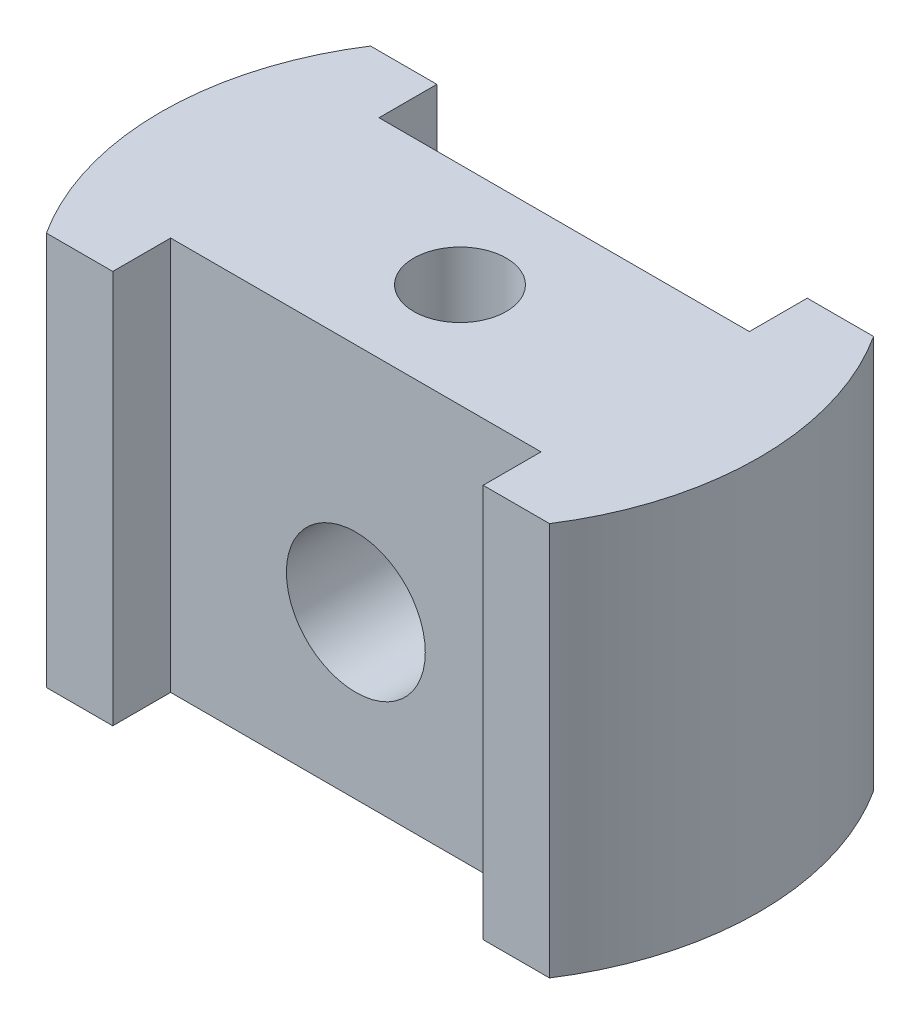
ISO-10303-21;
HEADER;
FILE_DESCRIPTION(('STEP AP214'),'2;1');
FILE_NAME('part.step','',(''),(''),'','','');
FILE_SCHEMA(('AUTOMOTIVE_DESIGN { 1 0 10303 214 1 1 1 1 }'));
ENDSEC;
DATA;
#1=APPLICATION_CONTEXT('core data for automotive mechanical design processes');
#2=APPLICATION_PROTOCOL_DEFINITION('international standard','automotive_design',2000,#1);
#3=PRODUCT_CONTEXT('',#1,'mechanical');
#4=PRODUCT('Part','Part','',(#3));
#5=PRODUCT_RELATED_PRODUCT_CATEGORY('part','',(#4));
#6=PRODUCT_DEFINITION_FORMATION('','',#4);
#7=PRODUCT_DEFINITION_CONTEXT('part definition',#1,'design');
#8=PRODUCT_DEFINITION('design','',#6,#7);
#9=PRODUCT_DEFINITION_SHAPE('','',#8);
#10=(LENGTH_UNIT() NAMED_UNIT(*) SI_UNIT(.MILLI.,.METRE.));
#11=(NAMED_UNIT(*) PLANE_ANGLE_UNIT() SI_UNIT($,.RADIAN.));
#12=(NAMED_UNIT(*) SI_UNIT($,.STERADIAN.) SOLID_ANGLE_UNIT());
#13=UNCERTAINTY_MEASURE_WITH_UNIT(LENGTH_MEASURE(1.E-05),#10,'distance_accuracy_value','');
#14=(GEOMETRIC_REPRESENTATION_CONTEXT(3) GLOBAL_UNCERTAINTY_ASSIGNED_CONTEXT((#13)) GLOBAL_UNIT_ASSIGNED_CONTEXT((#10,
#11,#12)) REPRESENTATION_CONTEXT('',''));
#15=CARTESIAN_POINT('',(0.,0.,0.));
#16=DIRECTION('',(0.,0.,1.));
#17=DIRECTION('',(1.,0.,0.));
#18=AXIS2_PLACEMENT_3D('',#15,#16,#17);
#19=CARTESIAN_POINT('',(-8.,8.5,-7.));
#20=DIRECTION('',(0.,0.,1.));
#21=DIRECTION('',(1.,0.,0.));
#22=AXIS2_PLACEMENT_3D('',#19,#20,#21);
#23=PLANE('',#22);
#24=DIRECTION('',(-1.,0.,0.));
#25=VECTOR('',#24,1.);
#26=CARTESIAN_POINT('',(-8.,-8.5,-7.));
#27=LINE('',#26,#25);
#28=CARTESIAN_POINT('',(-8.,-8.5,-7.));
#29=VERTEX_POINT('',#28);
#30=CARTESIAN_POINT('',(-10.8665838527156,-8.5,-7.));
#31=VERTEX_POINT('',#30);
#32=EDGE_CURVE('E167',#29,#31,#27,.T.);
#33=ORIENTED_EDGE('',*,*,#32,.T.);
#34=DIRECTION('',(0.,-1.,0.));
#35=VECTOR('',#34,1.);
#36=CARTESIAN_POINT('',(-10.8665838527156,8.5,-7.));
#37=LINE('',#36,#35);
#38=CARTESIAN_POINT('',(-10.8665838527156,8.5,-7.));
#39=VERTEX_POINT('',#38);
#40=EDGE_CURVE('E11',#39,#31,#37,.T.);
#41=ORIENTED_EDGE('',*,*,#40,.F.);
#42=DIRECTION('',(-1.,0.,0.));
#43=VECTOR('',#42,1.);
#44=CARTESIAN_POINT('',(-8.,8.5,-7.));
#45=LINE('',#44,#43);
#46=CARTESIAN_POINT('',(-8.,8.5,-7.));
#47=VERTEX_POINT('',#46);
#48=EDGE_CURVE('E186',#47,#39,#45,.T.);
#49=ORIENTED_EDGE('',*,*,#48,.F.);
#50=DIRECTION('',(0.,-1.,0.));
#51=VECTOR('',#50,1.);
#52=CARTESIAN_POINT('',(-8.,8.5,-7.));
#53=LINE('',#52,#51);
#54=EDGE_CURVE('E165',#47,#29,#53,.T.);
#55=ORIENTED_EDGE('',*,*,#54,.T.);
#56=EDGE_LOOP('',(#33,#41,#49,#55));
#57=FACE_BOUND('',#56,.T.);
#58=ADVANCED_FACE('F43',(#57),#23,.F.);
#59=CARTESIAN_POINT('',(0.,8.5,0.));
#60=DIRECTION('',(0.,-1.,0.));
#61=DIRECTION('',(0.,0.,-1.));
#62=AXIS2_PLACEMENT_3D('',#59,#60,#61);
#63=CYLINDRICAL_SURFACE('',#62,12.9260452044738);
#64=CARTESIAN_POINT('',(0.,-8.5,0.));
#65=DIRECTION('',(0.,1.,0.));
#66=DIRECTION('',(0.,0.,1.));
#67=AXIS2_PLACEMENT_3D('',#64,#65,#66);
#68=CIRCLE('',#67,12.9260452044738);
#69=CARTESIAN_POINT('',(-10.8665838527156,-8.5,7.));
#70=VERTEX_POINT('',#69);
#71=EDGE_CURVE('E166',#31,#70,#68,.T.);
#72=ORIENTED_EDGE('',*,*,#71,.T.);
#73=DIRECTION('',(0.,-1.,0.));
#74=VECTOR('',#73,1.);
#75=CARTESIAN_POINT('',(-10.8665838527156,8.5,7.));
#76=LINE('',#75,#74);
#77=CARTESIAN_POINT('',(-10.8665838527156,8.5,7.));
#78=VERTEX_POINT('',#77);
#79=EDGE_CURVE('E55',#78,#70,#76,.T.);
#80=ORIENTED_EDGE('',*,*,#79,.F.);
#81=CARTESIAN_POINT('',(0.,8.5,0.));
#82=DIRECTION('',(0.,1.,0.));
#83=DIRECTION('',(0.,0.,1.));
#84=AXIS2_PLACEMENT_3D('',#81,#82,#83);
#85=CIRCLE('',#84,12.9260452044738);
#86=EDGE_CURVE('E117',#39,#78,#85,.T.);
#87=ORIENTED_EDGE('',*,*,#86,.F.);
#88=ORIENTED_EDGE('',*,*,#40,.T.);
#89=EDGE_LOOP('',(#72,#80,#87,#88));
#90=FACE_BOUND('',#89,.T.);
#91=ADVANCED_FACE('F269',(#90),#63,.T.);
#92=CARTESIAN_POINT('',(-8.,8.5,7.));
#93=DIRECTION('',(0.,0.,-1.));
#94=DIRECTION('',(-1.,0.,0.));
#95=AXIS2_PLACEMENT_3D('',#92,#93,#94);
#96=PLANE('',#95);
#97=DIRECTION('',(1.,0.,0.));
#98=VECTOR('',#97,1.);
#99=CARTESIAN_POINT('',(-8.,-8.5,7.));
#100=LINE('',#99,#98);
#101=CARTESIAN_POINT('',(-8.,-8.5,7.));
#102=VERTEX_POINT('',#101);
#103=EDGE_CURVE('E175',#70,#102,#100,.T.);
#104=ORIENTED_EDGE('',*,*,#103,.T.);
#105=DIRECTION('',(0.,-1.,0.));
#106=VECTOR('',#105,1.);
#107=CARTESIAN_POINT('',(-8.,8.5,7.));
#108=LINE('',#107,#106);
#109=CARTESIAN_POINT('',(-8.,8.5,7.));
#110=VERTEX_POINT('',#109);
#111=EDGE_CURVE('E208',#110,#102,#108,.T.);
#112=ORIENTED_EDGE('',*,*,#111,.F.);
#113=DIRECTION('',(1.,0.,0.));
#114=VECTOR('',#113,1.);
#115=CARTESIAN_POINT('',(-8.,8.5,7.));
#116=LINE('',#115,#114);
#117=EDGE_CURVE('E220',#78,#110,#116,.T.);
#118=ORIENTED_EDGE('',*,*,#117,.F.);
#119=ORIENTED_EDGE('',*,*,#79,.T.);
#120=EDGE_LOOP('',(#104,#112,#118,#119));
#121=FACE_BOUND('',#120,.T.);
#122=ADVANCED_FACE('F214',(#121),#96,.F.);
#123=CARTESIAN_POINT('',(-8.,8.5,7.));
#124=DIRECTION('',(-1.,0.,0.));
#125=DIRECTION('',(0.,0.,1.));
#126=AXIS2_PLACEMENT_3D('',#123,#124,#125);
#127=PLANE('',#126);
#128=DIRECTION('',(0.,0.,-1.));
#129=VECTOR('',#128,1.);
#130=CARTESIAN_POINT('',(-8.,-8.5,7.));
#131=LINE('',#130,#129);
#132=CARTESIAN_POINT('',(-8.,-8.5,4.5));
#133=VERTEX_POINT('',#132);
#134=EDGE_CURVE('E171',#102,#133,#131,.T.);
#135=ORIENTED_EDGE('',*,*,#134,.T.);
#136=DIRECTION('',(0.,-1.,0.));
#137=VECTOR('',#136,1.);
#138=CARTESIAN_POINT('',(-8.,8.5,4.5));
#139=LINE('',#138,#137);
#140=CARTESIAN_POINT('',(-8.,8.5,4.5));
#141=VERTEX_POINT('',#140);
#142=EDGE_CURVE('E202',#141,#133,#139,.T.);
#143=ORIENTED_EDGE('',*,*,#142,.F.);
#144=DIRECTION('',(0.,0.,-1.));
#145=VECTOR('',#144,1.);
#146=CARTESIAN_POINT('',(-8.,8.5,7.));
#147=LINE('',#146,#145);
#148=EDGE_CURVE('E233',#110,#141,#147,.T.);
#149=ORIENTED_EDGE('',*,*,#148,.F.);
#150=ORIENTED_EDGE('',*,*,#111,.T.);
#151=EDGE_LOOP('',(#135,#143,#149,#150));
#152=FACE_BOUND('',#151,.T.);
#153=ADVANCED_FACE('F227',(#152),#127,.F.);
#154=CARTESIAN_POINT('',(-8.,8.5,4.5));
#155=DIRECTION('',(0.,0.,-1.));
#156=DIRECTION('',(-1.,0.,0.));
#157=AXIS2_PLACEMENT_3D('',#154,#155,#156);
#158=PLANE('',#157);
#159=CARTESIAN_POINT('',(0.,-1.5,4.5));
#160=DIRECTION('',(0.,0.,-1.));
#161=DIRECTION('',(-1.,0.,0.));
#162=AXIS2_PLACEMENT_3D('',#159,#160,#161);
#163=CIRCLE('',#162,3.);
#164=CARTESIAN_POINT('',(-3.,-1.5,4.5));
#165=VERTEX_POINT('',#164);
#166=EDGE_CURVE('E479',#165,#165,#163,.T.);
#167=ORIENTED_EDGE('',*,*,#166,.T.);
#168=EDGE_LOOP('',(#167));
#169=FACE_BOUND('',#168,.T.);
#170=DIRECTION('',(1.,0.,0.));
#171=VECTOR('',#170,1.);
#172=CARTESIAN_POINT('',(-8.,-8.5,4.5));
#173=LINE('',#172,#171);
#174=CARTESIAN_POINT('',(8.,-8.5,4.5));
#175=VERTEX_POINT('',#174);
#176=EDGE_CURVE('E177',#133,#175,#173,.T.);
#177=ORIENTED_EDGE('',*,*,#176,.T.);
#178=DIRECTION('',(0.,-1.,0.));
#179=VECTOR('',#178,1.);
#180=CARTESIAN_POINT('',(8.,8.5,4.5));
#181=LINE('',#180,#179);
#182=CARTESIAN_POINT('',(8.,8.5,4.5));
#183=VERTEX_POINT('',#182);
#184=EDGE_CURVE('E205',#183,#175,#181,.T.);
#185=ORIENTED_EDGE('',*,*,#184,.F.);
#186=DIRECTION('',(1.,0.,0.));
#187=VECTOR('',#186,1.);
#188=CARTESIAN_POINT('',(-8.,8.5,4.5));
#189=LINE('',#188,#187);
#190=EDGE_CURVE('E235',#141,#183,#189,.T.);
#191=ORIENTED_EDGE('',*,*,#190,.F.);
#192=ORIENTED_EDGE('',*,*,#142,.T.);
#193=EDGE_LOOP('',(#177,#185,#191,#192));
#194=FACE_BOUND('',#193,.T.);
#195=ADVANCED_FACE('F228',(#169,#194),#158,.F.);
#196=CARTESIAN_POINT('',(8.,8.5,4.5));
#197=DIRECTION('',(1.,0.,0.));
#198=DIRECTION('',(0.,0.,-1.));
#199=AXIS2_PLACEMENT_3D('',#196,#197,#198);
#200=PLANE('',#199);
#201=DIRECTION('',(0.,0.,1.));
#202=VECTOR('',#201,1.);
#203=CARTESIAN_POINT('',(8.,-8.5,4.5));
#204=LINE('',#203,#202);
#205=CARTESIAN_POINT('',(8.,-8.5,7.));
#206=VERTEX_POINT('',#205);
#207=EDGE_CURVE('E179',#175,#206,#204,.T.);
#208=ORIENTED_EDGE('',*,*,#207,.T.);
#209=DIRECTION('',(0.,-1.,0.));
#210=VECTOR('',#209,1.);
#211=CARTESIAN_POINT('',(8.,8.5,7.));
#212=LINE('',#211,#210);
#213=CARTESIAN_POINT('',(8.,8.5,7.));
#214=VERTEX_POINT('',#213);
#215=EDGE_CURVE('E200',#214,#206,#212,.T.);
#216=ORIENTED_EDGE('',*,*,#215,.F.);
#217=DIRECTION('',(0.,0.,1.));
#218=VECTOR('',#217,1.);
#219=CARTESIAN_POINT('',(8.,8.5,4.5));
#220=LINE('',#219,#218);
#221=EDGE_CURVE('E231',#183,#214,#220,.T.);
#222=ORIENTED_EDGE('',*,*,#221,.F.);
#223=ORIENTED_EDGE('',*,*,#184,.T.);
#224=EDGE_LOOP('',(#208,#216,#222,#223));
#225=FACE_BOUND('',#224,.T.);
#226=ADVANCED_FACE('F284',(#225),#200,.F.);
#227=CARTESIAN_POINT('',(8.,8.5,7.));
#228=DIRECTION('',(0.,0.,-1.));
#229=DIRECTION('',(-1.,0.,0.));
#230=AXIS2_PLACEMENT_3D('',#227,#228,#229);
#231=PLANE('',#230);
#232=DIRECTION('',(1.,0.,0.));
#233=VECTOR('',#232,1.);
#234=CARTESIAN_POINT('',(8.,-8.5,7.));
#235=LINE('',#234,#233);
#236=CARTESIAN_POINT('',(10.8665838527156,-8.5,7.));
#237=VERTEX_POINT('',#236);
#238=EDGE_CURVE('E178',#206,#237,#235,.T.);
#239=ORIENTED_EDGE('',*,*,#238,.T.);
#240=DIRECTION('',(0.,-1.,0.));
#241=VECTOR('',#240,1.);
#242=CARTESIAN_POINT('',(10.8665838527156,8.5,7.));
#243=LINE('',#242,#241);
#244=CARTESIAN_POINT('',(10.8665838527156,8.5,7.));
#245=VERTEX_POINT('',#244);
#246=EDGE_CURVE('E198',#245,#237,#243,.T.);
#247=ORIENTED_EDGE('',*,*,#246,.F.);
#248=DIRECTION('',(1.,0.,0.));
#249=VECTOR('',#248,1.);
#250=CARTESIAN_POINT('',(8.,8.5,7.));
#251=LINE('',#250,#249);
#252=EDGE_CURVE('E240',#214,#245,#251,.T.);
#253=ORIENTED_EDGE('',*,*,#252,.F.);
#254=ORIENTED_EDGE('',*,*,#215,.T.);
#255=EDGE_LOOP('',(#239,#247,#253,#254));
#256=FACE_BOUND('',#255,.T.);
#257=ADVANCED_FACE('F290',(#256),#231,.F.);
#258=CARTESIAN_POINT('',(0.,8.5,0.));
#259=DIRECTION('',(0.,-1.,0.));
#260=DIRECTION('',(0.,0.,-1.));
#261=AXIS2_PLACEMENT_3D('',#258,#259,#260);
#262=CYLINDRICAL_SURFACE('',#261,12.9260452044738);
#263=CARTESIAN_POINT('',(0.,-8.5,0.));
#264=DIRECTION('',(0.,1.,0.));
#265=DIRECTION('',(0.,0.,1.));
#266=AXIS2_PLACEMENT_3D('',#263,#264,#265);
#267=CIRCLE('',#266,12.9260452044738);
#268=CARTESIAN_POINT('',(10.8665838527156,-8.5,-7.));
#269=VERTEX_POINT('',#268);
#270=EDGE_CURVE('E185',#237,#269,#267,.T.);
#271=ORIENTED_EDGE('',*,*,#270,.T.);
#272=DIRECTION('',(0.,-1.,0.));
#273=VECTOR('',#272,1.);
#274=CARTESIAN_POINT('',(10.8665838527156,8.5,-7.));
#275=LINE('',#274,#273);
#276=CARTESIAN_POINT('',(10.8665838527156,8.5,-7.));
#277=VERTEX_POINT('',#276);
#278=EDGE_CURVE('E194',#277,#269,#275,.T.);
#279=ORIENTED_EDGE('',*,*,#278,.F.);
#280=CARTESIAN_POINT('',(0.,8.5,0.));
#281=DIRECTION('',(0.,1.,0.));
#282=DIRECTION('',(0.,0.,1.));
#283=AXIS2_PLACEMENT_3D('',#280,#281,#282);
#284=CIRCLE('',#283,12.9260452044738);
#285=EDGE_CURVE('E244',#245,#277,#284,.T.);
#286=ORIENTED_EDGE('',*,*,#285,.F.);
#287=ORIENTED_EDGE('',*,*,#246,.T.);
#288=EDGE_LOOP('',(#271,#279,#286,#287));
#289=FACE_BOUND('',#288,.T.);
#290=ADVANCED_FACE('F246',(#289),#262,.T.);
#291=CARTESIAN_POINT('',(8.,8.5,-7.));
#292=DIRECTION('',(0.,0.,1.));
#293=DIRECTION('',(1.,0.,0.));
#294=AXIS2_PLACEMENT_3D('',#291,#292,#293);
#295=PLANE('',#294);
#296=DIRECTION('',(-1.,0.,0.));
#297=VECTOR('',#296,1.);
#298=CARTESIAN_POINT('',(8.,-8.5,-7.));
#299=LINE('',#298,#297);
#300=CARTESIAN_POINT('',(8.,-8.5,-7.));
#301=VERTEX_POINT('',#300);
#302=EDGE_CURVE('E184',#269,#301,#299,.T.);
#303=ORIENTED_EDGE('',*,*,#302,.T.);
#304=DIRECTION('',(0.,-1.,0.));
#305=VECTOR('',#304,1.);
#306=CARTESIAN_POINT('',(8.,8.5,-7.));
#307=LINE('',#306,#305);
#308=CARTESIAN_POINT('',(8.,8.5,-7.));
#309=VERTEX_POINT('',#308);
#310=EDGE_CURVE('E160',#309,#301,#307,.T.);
#311=ORIENTED_EDGE('',*,*,#310,.F.);
#312=DIRECTION('',(-1.,0.,0.));
#313=VECTOR('',#312,1.);
#314=CARTESIAN_POINT('',(8.,8.5,-7.));
#315=LINE('',#314,#313);
#316=EDGE_CURVE('E146',#277,#309,#315,.T.);
#317=ORIENTED_EDGE('',*,*,#316,.F.);
#318=ORIENTED_EDGE('',*,*,#278,.T.);
#319=EDGE_LOOP('',(#303,#311,#317,#318));
#320=FACE_BOUND('',#319,.T.);
#321=ADVANCED_FACE('F251',(#320),#295,.F.);
#322=CARTESIAN_POINT('',(8.,8.5,-4.5));
#323=DIRECTION('',(1.,0.,0.));
#324=DIRECTION('',(0.,0.,-1.));
#325=AXIS2_PLACEMENT_3D('',#322,#323,#324);
#326=PLANE('',#325);
#327=DIRECTION('',(0.,0.,1.));
#328=VECTOR('',#327,1.);
#329=CARTESIAN_POINT('',(8.,-8.5,-4.5));
#330=LINE('',#329,#328);
#331=CARTESIAN_POINT('',(8.,-8.5,-4.5));
#332=VERTEX_POINT('',#331);
#333=EDGE_CURVE('E156',#301,#332,#330,.T.);
#334=ORIENTED_EDGE('',*,*,#333,.T.);
#335=DIRECTION('',(0.,-1.,0.));
#336=VECTOR('',#335,1.);
#337=CARTESIAN_POINT('',(8.,8.5,-4.5));
#338=LINE('',#337,#336);
#339=CARTESIAN_POINT('',(8.,8.5,-4.5));
#340=VERTEX_POINT('',#339);
#341=EDGE_CURVE('E153',#340,#332,#338,.T.);
#342=ORIENTED_EDGE('',*,*,#341,.F.);
#343=DIRECTION('',(0.,0.,1.));
#344=VECTOR('',#343,1.);
#345=CARTESIAN_POINT('',(8.,8.5,-4.5));
#346=LINE('',#345,#344);
#347=EDGE_CURVE('E142',#309,#340,#346,.T.);
#348=ORIENTED_EDGE('',*,*,#347,.F.);
#349=ORIENTED_EDGE('',*,*,#310,.T.);
#350=EDGE_LOOP('',(#334,#342,#348,#349));
#351=FACE_BOUND('',#350,.T.);
#352=ADVANCED_FACE('F152',(#351),#326,.F.);
#353=CARTESIAN_POINT('',(-8.,8.5,-4.5));
#354=DIRECTION('',(0.,0.,1.));
#355=DIRECTION('',(1.,0.,0.));
#356=AXIS2_PLACEMENT_3D('',#353,#354,#355);
#357=PLANE('',#356);
#358=CARTESIAN_POINT('',(0.,-1.5,-4.5));
#359=DIRECTION('',(0.,0.,1.));
#360=DIRECTION('',(1.,0.,0.));
#361=AXIS2_PLACEMENT_3D('',#358,#359,#360);
#362=CIRCLE('',#361,3.);
#363=CARTESIAN_POINT('',(3.,-1.5,-4.5));
#364=VERTEX_POINT('',#363);
#365=EDGE_CURVE('E46',#364,#364,#362,.T.);
#366=ORIENTED_EDGE('',*,*,#365,.T.);
#367=EDGE_LOOP('',(#366));
#368=FACE_BOUND('',#367,.T.);
#369=DIRECTION('',(-1.,0.,0.));
#370=VECTOR('',#369,1.);
#371=CARTESIAN_POINT('',(-8.,-8.5,-4.5));
#372=LINE('',#371,#370);
#373=CARTESIAN_POINT('',(-8.,-8.5,-4.5));
#374=VERTEX_POINT('',#373);
#375=EDGE_CURVE('E105',#332,#374,#372,.T.);
#376=ORIENTED_EDGE('',*,*,#375,.T.);
#377=DIRECTION('',(0.,-1.,0.));
#378=VECTOR('',#377,1.);
#379=CARTESIAN_POINT('',(-8.,8.5,-4.5));
#380=LINE('',#379,#378);
#381=CARTESIAN_POINT('',(-8.,8.5,-4.5));
#382=VERTEX_POINT('',#381);
#383=EDGE_CURVE('E158',#382,#374,#380,.T.);
#384=ORIENTED_EDGE('',*,*,#383,.F.);
#385=DIRECTION('',(-1.,0.,0.));
#386=VECTOR('',#385,1.);
#387=CARTESIAN_POINT('',(-8.,8.5,-4.5));
#388=LINE('',#387,#386);
#389=EDGE_CURVE('E148',#340,#382,#388,.T.);
#390=ORIENTED_EDGE('',*,*,#389,.F.);
#391=ORIENTED_EDGE('',*,*,#341,.T.);
#392=EDGE_LOOP('',(#376,#384,#390,#391));
#393=FACE_BOUND('',#392,.T.);
#394=ADVANCED_FACE('F159',(#368,#393),#357,.F.);
#395=CARTESIAN_POINT('',(-8.,8.5,-7.));
#396=DIRECTION('',(-1.,0.,0.));
#397=DIRECTION('',(0.,0.,1.));
#398=AXIS2_PLACEMENT_3D('',#395,#396,#397);
#399=PLANE('',#398);
#400=DIRECTION('',(0.,0.,-1.));
#401=VECTOR('',#400,1.);
#402=CARTESIAN_POINT('',(-8.,-8.5,-7.));
#403=LINE('',#402,#401);
#404=EDGE_CURVE('E107',#374,#29,#403,.T.);
#405=ORIENTED_EDGE('',*,*,#404,.T.);
#406=ORIENTED_EDGE('',*,*,#54,.F.);
#407=DIRECTION('',(0.,0.,-1.));
#408=VECTOR('',#407,1.);
#409=CARTESIAN_POINT('',(-8.,8.5,-7.));
#410=LINE('',#409,#408);
#411=EDGE_CURVE('E58',#382,#47,#410,.T.);
#412=ORIENTED_EDGE('',*,*,#411,.F.);
#413=ORIENTED_EDGE('',*,*,#383,.T.);
#414=EDGE_LOOP('',(#405,#406,#412,#413));
#415=FACE_BOUND('',#414,.T.);
#416=ADVANCED_FACE('F260',(#415),#399,.F.);
#417=CARTESIAN_POINT('',(0.,8.5,0.));
#418=DIRECTION('',(0.,1.,0.));
#419=DIRECTION('',(0.,0.,1.));
#420=AXIS2_PLACEMENT_3D('',#417,#418,#419);
#421=PLANE('',#420);
#422=CARTESIAN_POINT('',(0.,8.5,0.));
#423=DIRECTION('',(0.,1.,0.));
#424=DIRECTION('',(0.,0.,1.));
#425=AXIS2_PLACEMENT_3D('',#422,#423,#424);
#426=CIRCLE('',#425,2.);
#427=CARTESIAN_POINT('',(0.,8.5,2.));
#428=VERTEX_POINT('',#427);
#429=EDGE_CURVE('E477',#428,#428,#426,.T.);
#430=ORIENTED_EDGE('',*,*,#429,.F.);
#431=EDGE_LOOP('',(#430));
#432=FACE_BOUND('',#431,.T.);
#433=ORIENTED_EDGE('',*,*,#48,.T.);
#434=ORIENTED_EDGE('',*,*,#86,.T.);
#435=ORIENTED_EDGE('',*,*,#117,.T.);
#436=ORIENTED_EDGE('',*,*,#148,.T.);
#437=ORIENTED_EDGE('',*,*,#190,.T.);
#438=ORIENTED_EDGE('',*,*,#221,.T.);
#439=ORIENTED_EDGE('',*,*,#252,.T.);
#440=ORIENTED_EDGE('',*,*,#285,.T.);
#441=ORIENTED_EDGE('',*,*,#316,.T.);
#442=ORIENTED_EDGE('',*,*,#347,.T.);
#443=ORIENTED_EDGE('',*,*,#389,.T.);
#444=ORIENTED_EDGE('',*,*,#411,.T.);
#445=EDGE_LOOP('',(#433,#434,#435,#436,#437,#438,#439,#440,#441,#442,#443,#444));
#446=FACE_BOUND('',#445,.T.);
#447=ADVANCED_FACE('F145',(#432,#446),#421,.T.);
#448=CARTESIAN_POINT('',(0.,-8.5,0.));
#449=DIRECTION('',(0.,1.,0.));
#450=DIRECTION('',(0.,0.,1.));
#451=AXIS2_PLACEMENT_3D('',#448,#449,#450);
#452=PLANE('',#451);
#453=ORIENTED_EDGE('',*,*,#32,.F.);
#454=ORIENTED_EDGE('',*,*,#404,.F.);
#455=ORIENTED_EDGE('',*,*,#375,.F.);
#456=ORIENTED_EDGE('',*,*,#333,.F.);
#457=ORIENTED_EDGE('',*,*,#302,.F.);
#458=ORIENTED_EDGE('',*,*,#270,.F.);
#459=ORIENTED_EDGE('',*,*,#238,.F.);
#460=ORIENTED_EDGE('',*,*,#207,.F.);
#461=ORIENTED_EDGE('',*,*,#176,.F.);
#462=ORIENTED_EDGE('',*,*,#134,.F.);
#463=ORIENTED_EDGE('',*,*,#103,.F.);
#464=ORIENTED_EDGE('',*,*,#71,.F.);
#465=EDGE_LOOP('',(#453,#454,#455,#456,#457,#458,#459,#460,#461,#462,#463,#464));
#466=FACE_BOUND('',#465,.T.);
#467=ADVANCED_FACE('F222',(#466),#452,.F.);
#468=CARTESIAN_POINT('',(0.,3.20172123805512,0.));
#469=DIRECTION('',(0.,1.,0.));
#470=DIRECTION('',(0.,0.,1.));
#471=AXIS2_PLACEMENT_3D('',#468,#469,#470);
#472=CONICAL_SURFACE('',#471,2.,1.02974425867665);
#473=CARTESIAN_POINT('',(0.,2.,0.));
#474=VERTEX_POINT('',#473);
#475=VERTEX_LOOP('',#474);
#476=FACE_BOUND('',#475,.T.);
#477=CARTESIAN_POINT('',(0.,3.20172123805512,0.));
#478=DIRECTION('',(0.,1.,0.));
#479=DIRECTION('',(0.,0.,1.));
#480=AXIS2_PLACEMENT_3D('',#477,#478,#479);
#481=CIRCLE('',#480,2.);
#482=CARTESIAN_POINT('',(0.,3.20172123805512,2.));
#483=VERTEX_POINT('',#482);
#484=EDGE_CURVE('E168',#483,#483,#481,.T.);
#485=ORIENTED_EDGE('',*,*,#484,.T.);
#486=EDGE_LOOP('',(#485));
#487=FACE_BOUND('',#486,.T.);
#488=ADVANCED_FACE('F330',(#476,#487),#472,.F.);
#489=CARTESIAN_POINT('',(0.,8.5,0.));
#490=DIRECTION('',(0.,1.,0.));
#491=DIRECTION('',(0.,0.,1.));
#492=AXIS2_PLACEMENT_3D('',#489,#490,#491);
#493=CYLINDRICAL_SURFACE('',#492,2.);
#494=ORIENTED_EDGE('',*,*,#484,.F.);
#495=EDGE_LOOP('',(#494));
#496=FACE_BOUND('',#495,.T.);
#497=ORIENTED_EDGE('',*,*,#429,.T.);
#498=EDGE_LOOP('',(#497));
#499=FACE_BOUND('',#498,.T.);
#500=ADVANCED_FACE('F331',(#496,#499),#493,.F.);
#501=CARTESIAN_POINT('',(0.,-1.5,-7.));
#502=DIRECTION('',(0.,0.,1.));
#503=DIRECTION('',(1.,0.,0.));
#504=AXIS2_PLACEMENT_3D('',#501,#502,#503);
#505=CYLINDRICAL_SURFACE('',#504,3.);
#506=ORIENTED_EDGE('',*,*,#365,.F.);
#507=EDGE_LOOP('',(#506));
#508=FACE_BOUND('',#507,.T.);
#509=ORIENTED_EDGE('',*,*,#166,.F.);
#510=EDGE_LOOP('',(#509));
#511=FACE_BOUND('',#510,.T.);
#512=ADVANCED_FACE('F341',(#508,#511),#505,.F.);
#513=CLOSED_SHELL('',(#58,#91,#122,#153,#195,#226,#257,#290,#321,#352,#394,#416,#447,#467,#488,
#500,#512));
#514=MANIFOLD_SOLID_BREP('B2',#513);
#515=ADVANCED_BREP_SHAPE_REPRESENTATION('',(#18,#514),#14);
#516=SHAPE_DEFINITION_REPRESENTATION(#9,#515);
ENDSEC;
END-ISO-10303-21;
